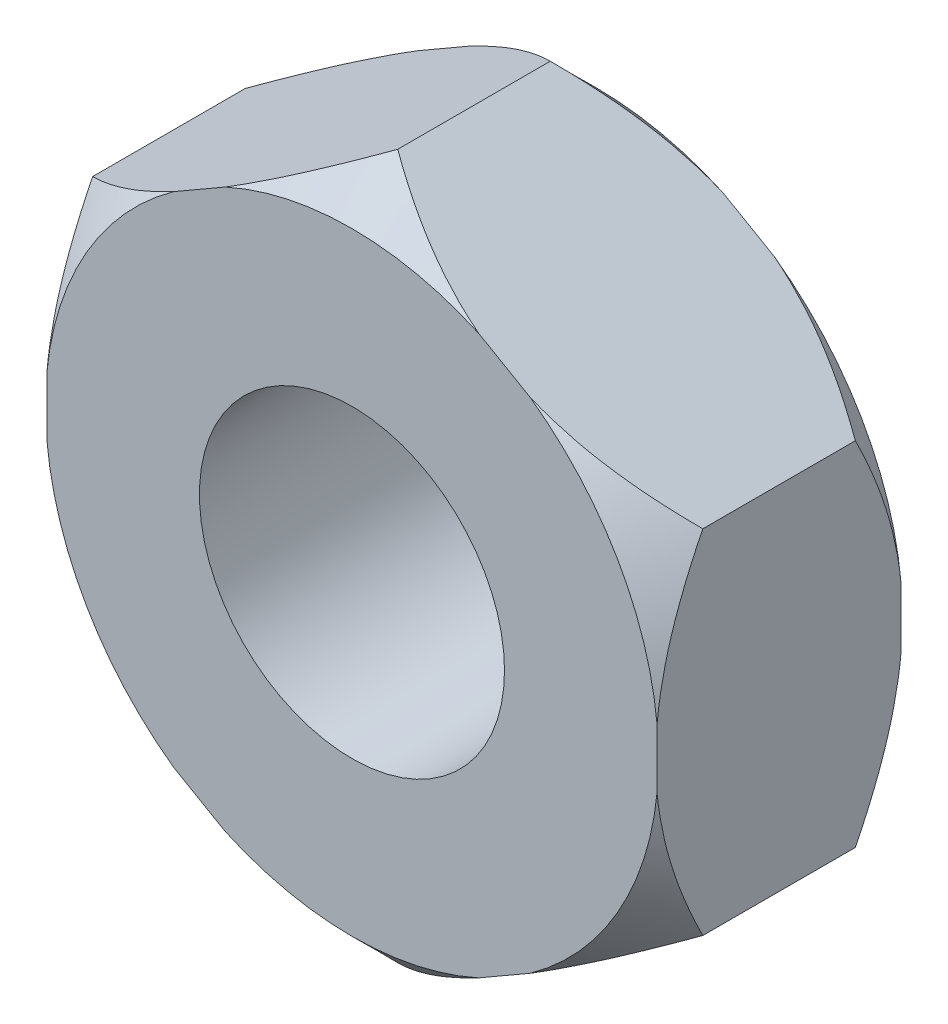
ISO-10303-21;
HEADER;
FILE_DESCRIPTION(('STEP AP214'),'2;1');
FILE_NAME('part.step','',(''),(''),'','','');
FILE_SCHEMA(('AUTOMOTIVE_DESIGN { 1 0 10303 214 1 1 1 1 }'));
ENDSEC;
DATA;
#1=APPLICATION_CONTEXT('core data for automotive mechanical design processes');
#2=APPLICATION_PROTOCOL_DEFINITION('international standard','automotive_design',2000,#1);
#3=PRODUCT_CONTEXT('',#1,'mechanical');
#4=PRODUCT('Part','Part','',(#3));
#5=PRODUCT_RELATED_PRODUCT_CATEGORY('part','',(#4));
#6=PRODUCT_DEFINITION_FORMATION('','',#4);
#7=PRODUCT_DEFINITION_CONTEXT('part definition',#1,'design');
#8=PRODUCT_DEFINITION('design','',#6,#7);
#9=PRODUCT_DEFINITION_SHAPE('','',#8);
#10=(LENGTH_UNIT() NAMED_UNIT(*) SI_UNIT(.MILLI.,.METRE.));
#11=(NAMED_UNIT(*) PLANE_ANGLE_UNIT() SI_UNIT($,.RADIAN.));
#12=(NAMED_UNIT(*) SI_UNIT($,.STERADIAN.) SOLID_ANGLE_UNIT());
#13=UNCERTAINTY_MEASURE_WITH_UNIT(LENGTH_MEASURE(1.E-05),#10,'distance_accuracy_value','');
#14=(GEOMETRIC_REPRESENTATION_CONTEXT(3) GLOBAL_UNCERTAINTY_ASSIGNED_CONTEXT((#13)) GLOBAL_UNIT_ASSIGNED_CONTEXT((#10,
#11,#12)) REPRESENTATION_CONTEXT('',''));
#15=CARTESIAN_POINT('',(0.,0.,0.));
#16=DIRECTION('',(0.,0.,1.));
#17=DIRECTION('',(1.,0.,0.));
#18=AXIS2_PLACEMENT_3D('',#15,#16,#17);
#19=CARTESIAN_POINT('',(2.,-1.15470053837925,1.6));
#20=DIRECTION('',(-1.,0.,0.));
#21=DIRECTION('',(0.,0.,1.));
#22=AXIS2_PLACEMENT_3D('',#19,#20,#21);
#23=PLANE('',#22);
#24=DIRECTION('',(0.,0.,-1.));
#25=VECTOR('',#24,1.);
#26=CARTESIAN_POINT('',(2.,1.15470053837925,1.6));
#27=LINE('',#26,#25);
#28=CARTESIAN_POINT('',(2.,1.15470053837925,1.3));
#29=VERTEX_POINT('',#28);
#30=CARTESIAN_POINT('',(2.,1.15470053837925,0.3));
#31=VERTEX_POINT('',#30);
#32=EDGE_CURVE('E194',#29,#31,#27,.T.);
#33=ORIENTED_EDGE('',*,*,#32,.F.);
#34=CARTESIAN_POINT('',(2.,1.15540053837925,1.29964992044597));
#35=CARTESIAN_POINT('',(2.,1.07598307970233,1.33933842871864));
#36=CARTESIAN_POINT('',(2.,0.995237332637928,1.37669722527411));
#37=CARTESIAN_POINT('',(2.,0.830585992046122,1.44510252811465));
#38=CARTESIAN_POINT('',(2.,0.74666471159049,1.47611093511361));
#39=CARTESIAN_POINT('',(2.,0.577441111036847,1.52923019261199));
#40=CARTESIAN_POINT('',(2.,0.492181962939463,1.55147466981095));
#41=CARTESIAN_POINT('',(2.,0.319785145341833,1.58574808429675));
#42=CARTESIAN_POINT('',(2.,0.232652754202702,1.59780263686519));
#43=CARTESIAN_POINT('',(2.,0.0825108919408736,1.6086780994365));
#44=CARTESIAN_POINT('',(2.,0.0196958053490039,1.61028949251019));
#45=CARTESIAN_POINT('',(2.,-0.105831974231886,1.60758533819763));
#46=CARTESIAN_POINT('',(2.,-0.16854462357856,1.60326771174166));
#47=CARTESIAN_POINT('',(2.,-0.293378079606286,1.58895120412576));
#48=CARTESIAN_POINT('',(2.,-0.355498143752271,1.5789459575977));
#49=CARTESIAN_POINT('',(2.,-0.47866417220405,1.553803483363));
#50=CARTESIAN_POINT('',(2.,-0.539710218381506,1.53866664863245));
#51=CARTESIAN_POINT('',(2.,-0.696176852271683,1.49369920691265));
#52=CARTESIAN_POINT('',(2.,-0.790624559128797,1.46046872044348));
#53=CARTESIAN_POINT('',(2.,-0.929498789020052,1.40436662645714));
#54=CARTESIAN_POINT('',(2.,-0.975263644766602,1.3846542331507));
#55=CARTESIAN_POINT('',(2.,-1.06594468936343,1.34343178020059));
#56=CARTESIAN_POINT('',(2.,-1.11086138103775,1.32192282944693));
#57=CARTESIAN_POINT('',(2.,-1.15540053837925,1.29964992044598));
#58=B_SPLINE_CURVE_WITH_KNOTS('',3,(#34,#35,#36,#37,#38,#39,#40,#41,#42,#43,#44,#45,#46,#47,#48,
#49,#50,#51,#52,#53,#54,#55,#56,#57),.UNSPECIFIED.,.F.,.F.,(4,2,2,2,2,2,2,2,2,2,2,4),(0.,
0.266531815535443,0.534618651038126,0.798443082516287,1.06160232698144,1.24984278596183,
1.43814927019127,1.62666691595567,1.81517012833258,2.11490891168658,2.26437241800826,
2.41374434313419),.UNSPECIFIED.);
#59=CARTESIAN_POINT('',(2.,0.194146046259595,1.6));
#60=VERTEX_POINT('',#59);
#61=EDGE_CURVE('E363',#29,#60,#58,.T.);
#62=ORIENTED_EDGE('',*,*,#61,.T.);
#63=DIRECTION('',(0.,1.,0.));
#64=VECTOR('',#63,1.);
#65=CARTESIAN_POINT('',(2.,-1.15470053837925,1.6));
#66=LINE('',#65,#64);
#67=CARTESIAN_POINT('',(2.,-0.194146046259594,1.6));
#68=VERTEX_POINT('',#67);
#69=EDGE_CURVE('E240',#68,#60,#66,.T.);
#70=ORIENTED_EDGE('',*,*,#69,.F.);
#71=CARTESIAN_POINT('',(2.,-1.15470053837925,1.3));
#72=VERTEX_POINT('',#71);
#73=EDGE_CURVE('E393',#68,#72,#58,.T.);
#74=ORIENTED_EDGE('',*,*,#73,.T.);
#75=DIRECTION('',(0.,0.,-1.));
#76=VECTOR('',#75,1.);
#77=CARTESIAN_POINT('',(2.,-1.15470053837925,1.6));
#78=LINE('',#77,#76);
#79=CARTESIAN_POINT('',(2.,-1.15470053837925,0.3));
#80=VERTEX_POINT('',#79);
#81=EDGE_CURVE('E245',#72,#80,#78,.T.);
#82=ORIENTED_EDGE('',*,*,#81,.T.);
#83=CARTESIAN_POINT('',(2.,1.15540053837925,0.300350079554025));
#84=CARTESIAN_POINT('',(2.,1.07598307970233,0.26066157128136));
#85=CARTESIAN_POINT('',(2.,0.995237332637928,0.223302774725892));
#86=CARTESIAN_POINT('',(2.,0.830585992046122,0.154897471885353));
#87=CARTESIAN_POINT('',(2.,0.74666471159049,0.123889064886386));
#88=CARTESIAN_POINT('',(2.,0.577441111036847,0.0707698073880139));
#89=CARTESIAN_POINT('',(2.,0.492181962939463,0.0485253301890504));
#90=CARTESIAN_POINT('',(2.,0.319785145341832,0.0142519157032477));
#91=CARTESIAN_POINT('',(2.,0.232652754202701,0.00219736313481565));
#92=CARTESIAN_POINT('',(2.,0.0825108919408722,-0.0086780994365017));
#93=CARTESIAN_POINT('',(2.,0.0196958053490022,-0.0102894925101871));
#94=CARTESIAN_POINT('',(2.,-0.105831974231888,-0.0075853381976253));
#95=CARTESIAN_POINT('',(2.,-0.168544623578563,-0.00326771174166417));
#96=CARTESIAN_POINT('',(2.,-0.293378079606289,0.0110487958742398));
#97=CARTESIAN_POINT('',(2.,-0.355498143752274,0.0210540424022981));
#98=CARTESIAN_POINT('',(2.,-0.478664172204053,0.0461965166370041));
#99=CARTESIAN_POINT('',(2.,-0.539710218381509,0.0613333513675514));
#100=CARTESIAN_POINT('',(2.,-0.696176852271686,0.106300793087349));
#101=CARTESIAN_POINT('',(2.,-0.790624559128799,0.13953127955652));
#102=CARTESIAN_POINT('',(2.,-0.929498789020054,0.195633373542859));
#103=CARTESIAN_POINT('',(2.,-0.975263644766603,0.215345766849299));
#104=CARTESIAN_POINT('',(2.,-1.06594468936343,0.25656821979941));
#105=CARTESIAN_POINT('',(2.,-1.11086138103775,0.278077170553066));
#106=CARTESIAN_POINT('',(2.,-1.15540053837925,0.300350079554025));
#107=B_SPLINE_CURVE_WITH_KNOTS('',3,(#83,#84,#85,#86,#87,#88,#89,#90,#91,#92,#93,#94,#95,#96,
#97,#98,#99,#100,#101,#102,#103,#104,#105,#106),.UNSPECIFIED.,.F.,.F.,(4,2,2,2,2,2,2,2,2,2,2,4),
(0.,0.266531815535442,0.534618651038126,0.798443082516287,1.06160232698145,1.24984278596183,
1.43814927019128,1.62666691595567,1.81517012833258,2.11490891168658,2.26437241800826,
2.41374434313419),.UNSPECIFIED.);
#108=CARTESIAN_POINT('',(2.,-0.194146046259585,0.));
#109=VERTEX_POINT('',#108);
#110=EDGE_CURVE('E230',#109,#80,#107,.T.);
#111=ORIENTED_EDGE('',*,*,#110,.F.);
#112=DIRECTION('',(0.,1.,0.));
#113=VECTOR('',#112,1.);
#114=CARTESIAN_POINT('',(2.,-1.15470053837925,0.));
#115=LINE('',#114,#113);
#116=CARTESIAN_POINT('',(2.,0.194146046259586,0.));
#117=VERTEX_POINT('',#116);
#118=EDGE_CURVE('E359',#109,#117,#115,.T.);
#119=ORIENTED_EDGE('',*,*,#118,.T.);
#120=EDGE_CURVE('E407',#31,#117,#107,.T.);
#121=ORIENTED_EDGE('',*,*,#120,.F.);
#122=EDGE_LOOP('',(#33,#62,#70,#74,#82,#111,#119,#121));
#123=FACE_BOUND('',#122,.T.);
#124=ADVANCED_FACE('F38',(#123),#23,.F.);
#125=CARTESIAN_POINT('',(2.,1.15470053837925,1.6));
#126=DIRECTION('',(-0.5,-0.866025403784438,0.));
#127=DIRECTION('',(0.866025403784439,-0.5,0.));
#128=AXIS2_PLACEMENT_3D('',#125,#126,#127);
#129=PLANE('',#128);
#130=DIRECTION('',(0.,0.,-1.));
#131=VECTOR('',#130,1.);
#132=CARTESIAN_POINT('',(0.,2.3094010767585,1.6));
#133=LINE('',#132,#131);
#134=CARTESIAN_POINT('',(0.,2.3094010767585,1.3));
#135=VERTEX_POINT('',#134);
#136=CARTESIAN_POINT('',(0.,2.3094010767585,0.3));
#137=VERTEX_POINT('',#136);
#138=EDGE_CURVE('E190',#135,#137,#133,.T.);
#139=ORIENTED_EDGE('',*,*,#138,.F.);
#140=CARTESIAN_POINT('',(-0.0007,2.30980522194694,1.29959574874202));
#141=CARTESIAN_POINT('',(0.068083196107106,2.27009322515878,1.33929028933997));
#142=CARTESIAN_POINT('',(0.138016875531649,2.22971699651759,1.37665501862968));
#143=CARTESIAN_POINT('',(0.280621300984799,2.14738429309459,1.4450716391226));
#144=CARTESIAN_POINT('',(0.353305638434037,2.1054199713024,1.47608541683105));
#145=CARTESIAN_POINT('',(0.499870494418703,2.02080071224591,1.52921412866013));
#146=CARTESIAN_POINT('',(0.573713608315188,1.97816737055998,1.5514627364308));
#147=CARTESIAN_POINT('',(0.723027103507985,1.89196118391677,1.58574275518007));
#148=CARTESIAN_POINT('',(0.798492911093949,1.8483909795924,1.59779979274057));
#149=CARTESIAN_POINT('',(0.928526877276862,1.7733158342129,1.60867731831624));
#150=CARTESIAN_POINT('',(0.982926610656792,1.74190813350216,1.6102893184227));
#151=CARTESIAN_POINT('',(1.09163745254847,1.67914389967217,1.60758630879543));
#152=CARTESIAN_POINT('',(1.14594852327715,1.64778738836699,1.60326921971537));
#153=CARTESIAN_POINT('',(1.25405816655225,1.58537025672011,1.588953683966));
#154=CARTESIAN_POINT('',(1.30785609587052,1.55431000774636,1.57894886973377));
#155=CARTESIAN_POINT('',(1.41452176923082,1.4927265525185,1.55380714596106));
#156=CARTESIAN_POINT('',(1.46738958415813,1.46220330533875,1.53867062931246));
#157=CARTESIAN_POINT('',(1.60291313285527,1.38395874801692,1.49369774160604));
#158=CARTESIAN_POINT('',(1.68472571145274,1.33672423374058,1.46045890953942));
#159=CARTESIAN_POINT('',(1.80502095591802,1.26727174196632,1.40434178449648));
#160=CARTESIAN_POINT('',(1.84466318671434,1.24438428934479,1.38462396295642));
#161=CARTESIAN_POINT('',(1.92321234774083,1.19903391008152,1.34339000488177));
#162=CARTESIAN_POINT('',(1.96211971404935,1.17657073166984,1.32187497874848));
#163=CARTESIAN_POINT('',(2.0007,1.15429639319082,1.29959574874202));
#164=B_SPLINE_CURVE_WITH_KNOTS('',3,(#140,#141,#142,#143,#144,#145,#146,#147,#148,#149,#150,
#151,#152,#153,#154,#155,#156,#157,#158,#159,#160,#161,#162,#163),.UNSPECIFIED.,.F.,.F.,(4,2,2,
2,2,2,2,2,2,2,2,4),(0.,0.266557499637864,0.534670596071515,0.798519927456668,1.06170382238087,
1.24994527236908,1.43825275596299,1.62677147123019,1.81527575644104,2.11508275465517,
2.26458038271749,2.41398631747759),.UNSPECIFIED.);
#165=CARTESIAN_POINT('',(0.831864591894883,1.82912383069867,1.6));
#166=VERTEX_POINT('',#165);
#167=EDGE_CURVE('E336',#135,#166,#164,.T.);
#168=ORIENTED_EDGE('',*,*,#167,.T.);
#169=DIRECTION('',(-0.866025403784439,0.5,0.));
#170=VECTOR('',#169,1.);
#171=CARTESIAN_POINT('',(2.,1.15470053837925,1.6));
#172=LINE('',#171,#170);
#173=CARTESIAN_POINT('',(1.16813540810512,1.63497778443908,1.6));
#174=VERTEX_POINT('',#173);
#175=EDGE_CURVE('E346',#174,#166,#172,.T.);
#176=ORIENTED_EDGE('',*,*,#175,.F.);
#177=EDGE_CURVE('E343',#174,#29,#164,.T.);
#178=ORIENTED_EDGE('',*,*,#177,.T.);
#179=ORIENTED_EDGE('',*,*,#32,.T.);
#180=CARTESIAN_POINT('',(-0.0007,2.30980522194694,0.30040425125798));
#181=CARTESIAN_POINT('',(0.0680831961071059,2.27009322515878,0.260709710660034));
#182=CARTESIAN_POINT('',(0.138016875531649,2.22971699651759,0.223344981370319));
#183=CARTESIAN_POINT('',(0.280621300984799,2.14738429309459,0.154928360877404));
#184=CARTESIAN_POINT('',(0.353305638434037,2.1054199713024,0.123914583168952));
#185=CARTESIAN_POINT('',(0.499870494418703,2.02080071224591,0.0707858713398733));
#186=CARTESIAN_POINT('',(0.573713608315188,1.97816737055998,0.0485372635691986));
#187=CARTESIAN_POINT('',(0.723027103507985,1.89196118391677,0.0142572448199338));
#188=CARTESIAN_POINT('',(0.798492911093949,1.8483909795924,0.00220020725943478));
#189=CARTESIAN_POINT('',(0.928526877276863,1.7733158342129,-0.00867731831624132));
#190=CARTESIAN_POINT('',(0.982926610656792,1.74190813350216,-0.0102893184226965));
#191=CARTESIAN_POINT('',(1.09163745254847,1.67914389967217,-0.00758630879543114));
#192=CARTESIAN_POINT('',(1.14594852327715,1.64778738836699,-0.00326921971536437));
#193=CARTESIAN_POINT('',(1.25405816655225,1.58537025672011,0.0110463160340035));
#194=CARTESIAN_POINT('',(1.30785609587052,1.55431000774636,0.0210511302662269));
#195=CARTESIAN_POINT('',(1.41452176923082,1.4927265525185,0.0461928540389417));
#196=CARTESIAN_POINT('',(1.46738958415814,1.46220330533875,0.0613293706875385));
#197=CARTESIAN_POINT('',(1.60291313285528,1.38395874801692,0.106302258393956));
#198=CARTESIAN_POINT('',(1.68472571145274,1.33672423374058,0.139541090460579));
#199=CARTESIAN_POINT('',(1.80502095591802,1.26727174196632,0.195658215503524));
#200=CARTESIAN_POINT('',(1.84466318671434,1.24438428934479,0.215376037043584));
#201=CARTESIAN_POINT('',(1.92321234774083,1.19903391008152,0.256609995118227));
#202=CARTESIAN_POINT('',(1.96211971404935,1.17657073166984,0.278125021251518));
#203=CARTESIAN_POINT('',(2.0007,1.15429639319082,0.30040425125798));
#204=B_SPLINE_CURVE_WITH_KNOTS('',3,(#180,#181,#182,#183,#184,#185,#186,#187,#188,#189,#190,
#191,#192,#193,#194,#195,#196,#197,#198,#199,#200,#201,#202,#203),.UNSPECIFIED.,.F.,.F.,(4,2,2,
2,2,2,2,2,2,2,2,4),(0.,0.266557499637864,0.534670596071515,0.798519927456668,1.06170382238087,
1.24994527236908,1.43825275596299,1.62677147123019,1.81527575644104,2.11508275465517,
2.26458038271749,2.41398631747759),.UNSPECIFIED.);
#205=CARTESIAN_POINT('',(1.16813540810511,1.63497778443909,0.));
#206=VERTEX_POINT('',#205);
#207=EDGE_CURVE('E369',#206,#31,#204,.T.);
#208=ORIENTED_EDGE('',*,*,#207,.F.);
#209=DIRECTION('',(-0.866025403784439,0.5,0.));
#210=VECTOR('',#209,1.);
#211=CARTESIAN_POINT('',(2.,1.15470053837925,0.));
#212=LINE('',#211,#210);
#213=CARTESIAN_POINT('',(0.831864591894891,1.82912383069867,0.));
#214=VERTEX_POINT('',#213);
#215=EDGE_CURVE('E362',#206,#214,#212,.T.);
#216=ORIENTED_EDGE('',*,*,#215,.T.);
#217=EDGE_CURVE('E309',#137,#214,#204,.T.);
#218=ORIENTED_EDGE('',*,*,#217,.F.);
#219=EDGE_LOOP('',(#139,#168,#176,#178,#179,#208,#216,#218));
#220=FACE_BOUND('',#219,.T.);
#221=ADVANCED_FACE('F317',(#220),#129,.F.);
#222=CARTESIAN_POINT('',(0.,2.3094010767585,1.6));
#223=DIRECTION('',(0.5,-0.866025403784438,0.));
#224=DIRECTION('',(0.866025403784439,0.5,0.));
#225=AXIS2_PLACEMENT_3D('',#222,#223,#224);
#226=PLANE('',#225);
#227=DIRECTION('',(0.,0.,-1.));
#228=VECTOR('',#227,1.);
#229=CARTESIAN_POINT('',(-2.,1.15470053837925,1.6));
#230=LINE('',#229,#228);
#231=CARTESIAN_POINT('',(-2.,1.15470053837925,1.3));
#232=VERTEX_POINT('',#231);
#233=CARTESIAN_POINT('',(-2.,1.15470053837925,0.3));
#234=VERTEX_POINT('',#233);
#235=EDGE_CURVE('E179',#232,#234,#230,.T.);
#236=ORIENTED_EDGE('',*,*,#235,.F.);
#237=CARTESIAN_POINT('',(-2.0007,1.15429639319082,1.29959574874202));
#238=CARTESIAN_POINT('',(-1.93191680389289,1.19400838997898,1.33929028933997));
#239=CARTESIAN_POINT('',(-1.86198312446835,1.23438461862016,1.37665501862968));
#240=CARTESIAN_POINT('',(-1.7193786990152,1.31671732204317,1.4450716391226));
#241=CARTESIAN_POINT('',(-1.64669436156596,1.35868164383535,1.47608541683105));
#242=CARTESIAN_POINT('',(-1.5001295055813,1.44330090289184,1.52921412866013));
#243=CARTESIAN_POINT('',(-1.42628639168481,1.48593424457778,1.5514627364308));
#244=CARTESIAN_POINT('',(-1.27697289649201,1.57214043122098,1.58574275518007));
#245=CARTESIAN_POINT('',(-1.20150708890605,1.61571063554535,1.59779979274057));
#246=CARTESIAN_POINT('',(-1.07147312272314,1.69078578092485,1.60867731831624));
#247=CARTESIAN_POINT('',(-1.01707338934321,1.7221934816356,1.6102893184227));
#248=CARTESIAN_POINT('',(-0.908362547451533,1.78495771546559,1.60758630879543));
#249=CARTESIAN_POINT('',(-0.85405147672285,1.81631422677077,1.60326921971537));
#250=CARTESIAN_POINT('',(-0.745941833447751,1.87873135841764,1.588953683966));
#251=CARTESIAN_POINT('',(-0.692143904129476,1.90979160739139,1.57894886973377));
#252=CARTESIAN_POINT('',(-0.585478230769179,1.97137506261925,1.55380714596106));
#253=CARTESIAN_POINT('',(-0.532610415841865,2.001898309799,1.53867062931246));
#254=CARTESIAN_POINT('',(-0.397086867144726,2.08014286712083,1.49369774160604));
#255=CARTESIAN_POINT('',(-0.315274288547261,2.12737738139717,1.46045890953942));
#256=CARTESIAN_POINT('',(-0.19497904408198,2.19682987317144,1.40434178449648));
#257=CARTESIAN_POINT('',(-0.155336813285661,2.21971732579297,1.38462396295642));
#258=CARTESIAN_POINT('',(-0.0767876522591739,2.26506770505623,1.34339000488177));
#259=CARTESIAN_POINT('',(-0.0378802859506454,2.28753088346792,1.32187497874848));
#260=CARTESIAN_POINT('',(0.000700000000000051,2.30980522194694,1.29959574874202));
#261=B_SPLINE_CURVE_WITH_KNOTS('',3,(#237,#238,#239,#240,#241,#242,#243,#244,#245,#246,#247,
#248,#249,#250,#251,#252,#253,#254,#255,#256,#257,#258,#259,#260),.UNSPECIFIED.,.F.,.F.,(4,2,2,
2,2,2,2,2,2,2,2,4),(0.,0.266557499637864,0.534670596071515,0.798519927456668,1.06170382238087,
1.24994527236908,1.43825275596299,1.62677147123019,1.81527575644104,2.11508275465517,
2.26458038271749,2.41398631747759),.UNSPECIFIED.);
#262=CARTESIAN_POINT('',(-1.16813540810512,1.63497778443907,1.6));
#263=VERTEX_POINT('',#262);
#264=EDGE_CURVE('E322',#232,#263,#261,.T.);
#265=ORIENTED_EDGE('',*,*,#264,.T.);
#266=DIRECTION('',(-0.866025403784438,-0.5,0.));
#267=VECTOR('',#266,1.);
#268=CARTESIAN_POINT('',(0.,2.3094010767585,1.6));
#269=LINE('',#268,#267);
#270=CARTESIAN_POINT('',(-0.831864591894875,1.82912383069868,1.6));
#271=VERTEX_POINT('',#270);
#272=EDGE_CURVE('E349',#271,#263,#269,.T.);
#273=ORIENTED_EDGE('',*,*,#272,.F.);
#274=EDGE_CURVE('E329',#271,#135,#261,.T.);
#275=ORIENTED_EDGE('',*,*,#274,.T.);
#276=ORIENTED_EDGE('',*,*,#138,.T.);
#277=CARTESIAN_POINT('',(-2.0007,1.15429639319082,0.30040425125798));
#278=CARTESIAN_POINT('',(-1.93191680389289,1.19400838997898,0.260709710660033));
#279=CARTESIAN_POINT('',(-1.86198312446835,1.23438461862016,0.223344981370318));
#280=CARTESIAN_POINT('',(-1.7193786990152,1.31671732204317,0.154928360877404));
#281=CARTESIAN_POINT('',(-1.64669436156596,1.35868164383535,0.123914583168951));
#282=CARTESIAN_POINT('',(-1.5001295055813,1.44330090289184,0.070785871339873));
#283=CARTESIAN_POINT('',(-1.42628639168481,1.48593424457778,0.048537263569198));
#284=CARTESIAN_POINT('',(-1.27697289649201,1.57214043122098,0.0142572448199332));
#285=CARTESIAN_POINT('',(-1.20150708890605,1.61571063554535,0.00220020725943434));
#286=CARTESIAN_POINT('',(-1.07147312272314,1.69078578092485,-0.00867731831624174));
#287=CARTESIAN_POINT('',(-1.01707338934321,1.7221934816356,-0.010289318422697));
#288=CARTESIAN_POINT('',(-0.908362547451531,1.78495771546559,-0.00758630879543133));
#289=CARTESIAN_POINT('',(-0.854051476722848,1.81631422677077,-0.00326921971536426));
#290=CARTESIAN_POINT('',(-0.745941833447749,1.87873135841764,0.0110463160340036));
#291=CARTESIAN_POINT('',(-0.692143904129474,1.90979160739139,0.0210511302662267));
#292=CARTESIAN_POINT('',(-0.585478230769176,1.97137506261925,0.0461928540389414));
#293=CARTESIAN_POINT('',(-0.532610415841862,2.00189830979901,0.0613293706875384));
#294=CARTESIAN_POINT('',(-0.397086867144724,2.08014286712083,0.106302258393956));
#295=CARTESIAN_POINT('',(-0.315274288547259,2.12737738139718,0.13954109046058));
#296=CARTESIAN_POINT('',(-0.194979044081979,2.19682987317144,0.195658215503524));
#297=CARTESIAN_POINT('',(-0.155336813285661,2.21971732579297,0.215376037043584));
#298=CARTESIAN_POINT('',(-0.0767876522591738,2.26506770505623,0.256609995118227));
#299=CARTESIAN_POINT('',(-0.0378802859506454,2.28753088346792,0.278125021251518));
#300=CARTESIAN_POINT('',(0.000699999999999816,2.30980522194694,0.30040425125798));
#301=B_SPLINE_CURVE_WITH_KNOTS('',3,(#277,#278,#279,#280,#281,#282,#283,#284,#285,#286,#287,
#288,#289,#290,#291,#292,#293,#294,#295,#296,#297,#298,#299,#300),.UNSPECIFIED.,.F.,.F.,(4,2,2,
2,2,2,2,2,2,2,2,4),(0.,0.266557499637864,0.534670596071515,0.798519927456668,1.06170382238087,
1.24994527236908,1.43825275596299,1.62677147123019,1.81527575644104,2.11508275465517,
2.26458038271749,2.41398631747759),.UNSPECIFIED.);
#302=CARTESIAN_POINT('',(-0.831864591894883,1.82912383069867,0.));
#303=VERTEX_POINT('',#302);
#304=EDGE_CURVE('E183',#303,#137,#301,.T.);
#305=ORIENTED_EDGE('',*,*,#304,.F.);
#306=DIRECTION('',(-0.866025403784438,-0.5,0.));
#307=VECTOR('',#306,1.);
#308=CARTESIAN_POINT('',(0.,2.3094010767585,0.));
#309=LINE('',#308,#307);
#310=CARTESIAN_POINT('',(-1.16813540810512,1.63497778443908,0.));
#311=VERTEX_POINT('',#310);
#312=EDGE_CURVE('E182',#303,#311,#309,.T.);
#313=ORIENTED_EDGE('',*,*,#312,.T.);
#314=EDGE_CURVE('E165',#234,#311,#301,.T.);
#315=ORIENTED_EDGE('',*,*,#314,.F.);
#316=EDGE_LOOP('',(#236,#265,#273,#275,#276,#305,#313,#315));
#317=FACE_BOUND('',#316,.T.);
#318=ADVANCED_FACE('F177',(#317),#226,.F.);
#319=CARTESIAN_POINT('',(-2.,1.15470053837925,1.6));
#320=DIRECTION('',(1.,0.,0.));
#321=DIRECTION('',(0.,0.,-1.));
#322=AXIS2_PLACEMENT_3D('',#319,#320,#321);
#323=PLANE('',#322);
#324=DIRECTION('',(0.,0.,-1.));
#325=VECTOR('',#324,1.);
#326=CARTESIAN_POINT('',(-2.,-1.15470053837925,1.6));
#327=LINE('',#326,#325);
#328=CARTESIAN_POINT('',(-2.,-1.15470053837925,1.3));
#329=VERTEX_POINT('',#328);
#330=CARTESIAN_POINT('',(-2.,-1.15470053837925,0.3));
#331=VERTEX_POINT('',#330);
#332=EDGE_CURVE('E191',#329,#331,#327,.T.);
#333=ORIENTED_EDGE('',*,*,#332,.F.);
#334=CARTESIAN_POINT('',(-2.,-1.15540053837925,1.29964992044597));
#335=CARTESIAN_POINT('',(-2.,-1.07598307970233,1.33933842871864));
#336=CARTESIAN_POINT('',(-2.,-0.995237332637929,1.37669722527411));
#337=CARTESIAN_POINT('',(-2.,-0.830585992046123,1.44510252811465));
#338=CARTESIAN_POINT('',(-2.,-0.746664711590491,1.47611093511361));
#339=CARTESIAN_POINT('',(-2.,-0.577441111036848,1.52923019261199));
#340=CARTESIAN_POINT('',(-2.,-0.492181962939464,1.55147466981095));
#341=CARTESIAN_POINT('',(-2.,-0.319785145341833,1.58574808429675));
#342=CARTESIAN_POINT('',(-2.,-0.232652754202703,1.59780263686519));
#343=CARTESIAN_POINT('',(-2.,-0.0825108919408738,1.6086780994365));
#344=CARTESIAN_POINT('',(-2.,-0.019695805349004,1.61028949251019));
#345=CARTESIAN_POINT('',(-2.,0.105831974231886,1.60758533819763));
#346=CARTESIAN_POINT('',(-2.,0.16854462357856,1.60326771174167));
#347=CARTESIAN_POINT('',(-2.,0.293378079606286,1.58895120412576));
#348=CARTESIAN_POINT('',(-2.,0.355498143752271,1.5789459575977));
#349=CARTESIAN_POINT('',(-2.,0.47866417220405,1.553803483363));
#350=CARTESIAN_POINT('',(-2.,0.539710218381506,1.53866664863245));
#351=CARTESIAN_POINT('',(-2.,0.696176852271682,1.49369920691265));
#352=CARTESIAN_POINT('',(-2.,0.790624559128796,1.46046872044348));
#353=CARTESIAN_POINT('',(-2.,0.929498789020053,1.40436662645714));
#354=CARTESIAN_POINT('',(-2.,0.975263644766603,1.3846542331507));
#355=CARTESIAN_POINT('',(-2.,1.06594468936343,1.34343178020059));
#356=CARTESIAN_POINT('',(-2.,1.11086138103775,1.32192282944694));
#357=CARTESIAN_POINT('',(-2.,1.15540053837925,1.29964992044598));
#358=B_SPLINE_CURVE_WITH_KNOTS('',3,(#334,#335,#336,#337,#338,#339,#340,#341,#342,#343,#344,
#345,#346,#347,#348,#349,#350,#351,#352,#353,#354,#355,#356,#357),.UNSPECIFIED.,.F.,.F.,(4,2,2,
2,2,2,2,2,2,2,2,4),(0.,0.266531815535442,0.534618651038125,0.798443082516287,1.06160232698145,
1.24984278596183,1.43814927019127,1.62666691595567,1.81517012833258,2.11490891168658,
2.26437241800826,2.41374434313419),.UNSPECIFIED.);
#359=CARTESIAN_POINT('',(-2.,-0.194146046259598,1.6));
#360=VERTEX_POINT('',#359);
#361=EDGE_CURVE('E330',#329,#360,#358,.T.);
#362=ORIENTED_EDGE('',*,*,#361,.T.);
#363=DIRECTION('',(0.,-1.,0.));
#364=VECTOR('',#363,1.);
#365=CARTESIAN_POINT('',(-2.,1.15470053837925,1.6));
#366=LINE('',#365,#364);
#367=CARTESIAN_POINT('',(-2.,0.194146046259599,1.6));
#368=VERTEX_POINT('',#367);
#369=EDGE_CURVE('E352',#368,#360,#366,.T.);
#370=ORIENTED_EDGE('',*,*,#369,.F.);
#371=EDGE_CURVE('E189',#368,#232,#358,.T.);
#372=ORIENTED_EDGE('',*,*,#371,.T.);
#373=ORIENTED_EDGE('',*,*,#235,.T.);
#374=CARTESIAN_POINT('',(-2.,-1.15540053837925,0.300350079554026));
#375=CARTESIAN_POINT('',(-2.,-1.07598307970233,0.26066157128136));
#376=CARTESIAN_POINT('',(-2.,-0.995237332637928,0.223302774725892));
#377=CARTESIAN_POINT('',(-2.,-0.830585992046122,0.154897471885353));
#378=CARTESIAN_POINT('',(-2.,-0.74666471159049,0.123889064886386));
#379=CARTESIAN_POINT('',(-2.,-0.577441111036847,0.0707698073880138));
#380=CARTESIAN_POINT('',(-2.,-0.492181962939463,0.04852533018905));
#381=CARTESIAN_POINT('',(-2.,-0.319785145341832,0.0142519157032472));
#382=CARTESIAN_POINT('',(-2.,-0.232652754202701,0.00219736313481522));
#383=CARTESIAN_POINT('',(-2.,-0.0825108919408723,-0.00867809943650212));
#384=CARTESIAN_POINT('',(-2.,-0.0196958053490024,-0.0102894925101876));
#385=CARTESIAN_POINT('',(-2.,0.105831974231888,-0.00758533819762571));
#386=CARTESIAN_POINT('',(-2.,0.168544623578562,-0.00326771174166449));
#387=CARTESIAN_POINT('',(-2.,0.293378079606288,0.0110487958742392));
#388=CARTESIAN_POINT('',(-2.,0.355498143752273,0.0210540424022972));
#389=CARTESIAN_POINT('',(-2.,0.478664172204053,0.0461965166370033));
#390=CARTESIAN_POINT('',(-2.,0.539710218381509,0.0613333513675508));
#391=CARTESIAN_POINT('',(-2.,0.696176852271685,0.106300793087349));
#392=CARTESIAN_POINT('',(-2.,0.790624559128799,0.139531279556519));
#393=CARTESIAN_POINT('',(-2.,0.929498789020054,0.195633373542859));
#394=CARTESIAN_POINT('',(-2.,0.975263644766603,0.215345766849298));
#395=CARTESIAN_POINT('',(-2.,1.06594468936343,0.256568219799409));
#396=CARTESIAN_POINT('',(-2.,1.11086138103775,0.278077170553066));
#397=CARTESIAN_POINT('',(-2.,1.15540053837925,0.300350079554025));
#398=B_SPLINE_CURVE_WITH_KNOTS('',3,(#374,#375,#376,#377,#378,#379,#380,#381,#382,#383,#384,
#385,#386,#387,#388,#389,#390,#391,#392,#393,#394,#395,#396,#397),.UNSPECIFIED.,.F.,.F.,(4,2,2,
2,2,2,2,2,2,2,2,4),(0.,0.266531815535443,0.534618651038127,0.798443082516288,1.06160232698145,
1.24984278596183,1.43814927019128,1.62666691595567,1.81517012833258,2.11490891168658,
2.26437241800826,2.41374434313419),.UNSPECIFIED.);
#399=CARTESIAN_POINT('',(-2.,0.19414604625959,0.));
#400=VERTEX_POINT('',#399);
#401=EDGE_CURVE('E162',#400,#234,#398,.T.);
#402=ORIENTED_EDGE('',*,*,#401,.F.);
#403=DIRECTION('',(0.,-1.,0.));
#404=VECTOR('',#403,1.);
#405=CARTESIAN_POINT('',(-2.,1.15470053837925,0.));
#406=LINE('',#405,#404);
#407=CARTESIAN_POINT('',(-2.,-0.194146046259589,0.));
#408=VERTEX_POINT('',#407);
#409=EDGE_CURVE('E237',#400,#408,#406,.T.);
#410=ORIENTED_EDGE('',*,*,#409,.T.);
#411=EDGE_CURVE('E172',#331,#408,#398,.T.);
#412=ORIENTED_EDGE('',*,*,#411,.F.);
#413=EDGE_LOOP('',(#333,#362,#370,#372,#373,#402,#410,#412));
#414=FACE_BOUND('',#413,.T.);
#415=ADVANCED_FACE('F187',(#414),#323,.F.);
#416=CARTESIAN_POINT('',(-2.,-1.15470053837925,1.6));
#417=DIRECTION('',(0.5,0.866025403784439,0.));
#418=DIRECTION('',(-0.866025403784439,0.5,0.));
#419=AXIS2_PLACEMENT_3D('',#416,#417,#418);
#420=PLANE('',#419);
#421=DIRECTION('',(0.,0.,-1.));
#422=VECTOR('',#421,1.);
#423=CARTESIAN_POINT('',(0.,-2.3094010767585,1.6));
#424=LINE('',#423,#422);
#425=CARTESIAN_POINT('',(0.,-2.3094010767585,1.3));
#426=VERTEX_POINT('',#425);
#427=CARTESIAN_POINT('',(0.,-2.3094010767585,0.3));
#428=VERTEX_POINT('',#427);
#429=EDGE_CURVE('E197',#426,#428,#424,.T.);
#430=ORIENTED_EDGE('',*,*,#429,.F.);
#431=CARTESIAN_POINT('',(0.000699999999999566,-2.30980522194694,1.29959574874202));
#432=CARTESIAN_POINT('',(-0.0680831961071066,-2.27009322515878,1.33929028933997));
#433=CARTESIAN_POINT('',(-0.13801687553165,-2.22971699651759,1.37665501862968));
#434=CARTESIAN_POINT('',(-0.280621300984799,-2.14738429309459,1.4450716391226));
#435=CARTESIAN_POINT('',(-0.353305638434038,-2.1054199713024,1.47608541683105));
#436=CARTESIAN_POINT('',(-0.499870494418704,-2.02080071224591,1.52921412866013));
#437=CARTESIAN_POINT('',(-0.573713608315189,-1.97816737055998,1.5514627364308));
#438=CARTESIAN_POINT('',(-0.723027103507986,-1.89196118391677,1.58574275518007));
#439=CARTESIAN_POINT('',(-0.79849291109395,-1.8483909795924,1.59779979274056));
#440=CARTESIAN_POINT('',(-0.928526877276863,-1.7733158342129,1.60867731831624));
#441=CARTESIAN_POINT('',(-0.982926610656793,-1.74190813350216,1.6102893184227));
#442=CARTESIAN_POINT('',(-1.09163745254847,-1.67914389967217,1.60758630879543));
#443=CARTESIAN_POINT('',(-1.14594852327715,-1.64778738836699,1.60326921971536));
#444=CARTESIAN_POINT('',(-1.25405816655225,-1.58537025672011,1.588953683966));
#445=CARTESIAN_POINT('',(-1.30785609587052,-1.55431000774636,1.57894886973377));
#446=CARTESIAN_POINT('',(-1.41452176923082,-1.4927265525185,1.55380714596106));
#447=CARTESIAN_POINT('',(-1.46738958415814,-1.46220330533875,1.53867062931246));
#448=CARTESIAN_POINT('',(-1.60291313285527,-1.38395874801692,1.49369774160604));
#449=CARTESIAN_POINT('',(-1.68472571145274,-1.33672423374058,1.46045890953942));
#450=CARTESIAN_POINT('',(-1.80502095591802,-1.26727174196632,1.40434178449648));
#451=CARTESIAN_POINT('',(-1.84466318671434,-1.24438428934479,1.38462396295642));
#452=CARTESIAN_POINT('',(-1.92321234774083,-1.19903391008152,1.34339000488177));
#453=CARTESIAN_POINT('',(-1.96211971404935,-1.17657073166984,1.32187497874848));
#454=CARTESIAN_POINT('',(-2.0007,-1.15429639319082,1.29959574874202));
#455=B_SPLINE_CURVE_WITH_KNOTS('',3,(#431,#432,#433,#434,#435,#436,#437,#438,#439,#440,#441,
#442,#443,#444,#445,#446,#447,#448,#449,#450,#451,#452,#453,#454),.UNSPECIFIED.,.F.,.F.,(4,2,2,
2,2,2,2,2,2,2,2,4),(0.,0.266557499637865,0.534670596071516,0.798519927456669,1.06170382238087,
1.24994527236908,1.43825275596299,1.62677147123019,1.81527575644104,2.11508275465517,
2.26458038271749,2.41398631747759),.UNSPECIFIED.);
#456=CARTESIAN_POINT('',(-0.831864591894893,-1.82912383069867,1.6));
#457=VERTEX_POINT('',#456);
#458=EDGE_CURVE('E257',#426,#457,#455,.T.);
#459=ORIENTED_EDGE('',*,*,#458,.T.);
#460=DIRECTION('',(0.866025403784439,-0.5,0.));
#461=VECTOR('',#460,1.);
#462=CARTESIAN_POINT('',(-2.,-1.15470053837925,1.6));
#463=LINE('',#462,#461);
#464=CARTESIAN_POINT('',(-1.16813540810511,-1.63497778443909,1.6));
#465=VERTEX_POINT('',#464);
#466=EDGE_CURVE('E355',#465,#457,#463,.T.);
#467=ORIENTED_EDGE('',*,*,#466,.F.);
#468=EDGE_CURVE('E62',#465,#329,#455,.T.);
#469=ORIENTED_EDGE('',*,*,#468,.T.);
#470=ORIENTED_EDGE('',*,*,#332,.T.);
#471=CARTESIAN_POINT('',(0.000699999999999566,-2.30980522194694,0.300404251257981));
#472=CARTESIAN_POINT('',(-0.0680831961071065,-2.27009322515878,0.260709710660035));
#473=CARTESIAN_POINT('',(-0.13801687553165,-2.22971699651759,0.22334498137032));
#474=CARTESIAN_POINT('',(-0.2806213009848,-2.14738429309459,0.154928360877405));
#475=CARTESIAN_POINT('',(-0.353305638434038,-2.1054199713024,0.123914583168952));
#476=CARTESIAN_POINT('',(-0.499870494418704,-2.02080071224591,0.0707858713398739));
#477=CARTESIAN_POINT('',(-0.57371360831519,-1.97816737055998,0.0485372635691992));
#478=CARTESIAN_POINT('',(-0.723027103507987,-1.89196118391677,0.0142572448199346));
#479=CARTESIAN_POINT('',(-0.798492911093951,-1.8483909795924,0.00220020725943572));
#480=CARTESIAN_POINT('',(-0.928526877276864,-1.7733158342129,-0.00867731831624051));
#481=CARTESIAN_POINT('',(-0.982926610656794,-1.74190813350216,-0.0102893184226959));
#482=CARTESIAN_POINT('',(-1.09163745254847,-1.67914389967217,-0.0075863087954302));
#483=CARTESIAN_POINT('',(-1.14594852327715,-1.64778738836698,-0.00326921971536305));
#484=CARTESIAN_POINT('',(-1.25405816655225,-1.58537025672011,0.011046316034005));
#485=CARTESIAN_POINT('',(-1.30785609587053,-1.55431000774636,0.0210511302662282));
#486=CARTESIAN_POINT('',(-1.41452176923082,-1.4927265525185,0.0461928540389429));
#487=CARTESIAN_POINT('',(-1.46738958415814,-1.46220330533875,0.0613293706875397));
#488=CARTESIAN_POINT('',(-1.60291313285528,-1.38395874801692,0.106302258393957));
#489=CARTESIAN_POINT('',(-1.68472571145274,-1.33672423374058,0.139541090460581));
#490=CARTESIAN_POINT('',(-1.80502095591802,-1.26727174196632,0.195658215503525));
#491=CARTESIAN_POINT('',(-1.84466318671434,-1.24438428934479,0.215376037043585));
#492=CARTESIAN_POINT('',(-1.92321234774083,-1.19903391008152,0.256609995118228));
#493=CARTESIAN_POINT('',(-1.96211971404935,-1.17657073166984,0.278125021251518));
#494=CARTESIAN_POINT('',(-2.0007,-1.15429639319082,0.30040425125798));
#495=B_SPLINE_CURVE_WITH_KNOTS('',3,(#471,#472,#473,#474,#475,#476,#477,#478,#479,#480,#481,
#482,#483,#484,#485,#486,#487,#488,#489,#490,#491,#492,#493,#494),.UNSPECIFIED.,.F.,.F.,(4,2,2,
2,2,2,2,2,2,2,2,4),(0.,0.266557499637864,0.534670596071516,0.79851992745667,1.06170382238087,
1.24994527236908,1.43825275596299,1.62677147123019,1.81527575644104,2.11508275465517,
2.26458038271749,2.41398631747759),.UNSPECIFIED.);
#496=CARTESIAN_POINT('',(-1.1681354081051,-1.63497778443909,0.));
#497=VERTEX_POINT('',#496);
#498=EDGE_CURVE('E220',#497,#331,#495,.T.);
#499=ORIENTED_EDGE('',*,*,#498,.F.);
#500=DIRECTION('',(0.866025403784439,-0.5,0.));
#501=VECTOR('',#500,1.);
#502=CARTESIAN_POINT('',(-2.,-1.15470053837925,0.));
#503=LINE('',#502,#501);
#504=CARTESIAN_POINT('',(-0.831864591894901,-1.82912383069866,0.));
#505=VERTEX_POINT('',#504);
#506=EDGE_CURVE('E229',#497,#505,#503,.T.);
#507=ORIENTED_EDGE('',*,*,#506,.T.);
#508=EDGE_CURVE('E232',#428,#505,#495,.T.);
#509=ORIENTED_EDGE('',*,*,#508,.F.);
#510=EDGE_LOOP('',(#430,#459,#467,#469,#470,#499,#507,#509));
#511=FACE_BOUND('',#510,.T.);
#512=ADVANCED_FACE('F227',(#511),#420,.F.);
#513=CARTESIAN_POINT('',(0.,-2.3094010767585,1.6));
#514=DIRECTION('',(-0.5,0.866025403784438,0.));
#515=DIRECTION('',(-0.866025403784438,-0.5,0.));
#516=AXIS2_PLACEMENT_3D('',#513,#514,#515);
#517=PLANE('',#516);
#518=ORIENTED_EDGE('',*,*,#81,.F.);
#519=CARTESIAN_POINT('',(2.0007,-1.15429639319082,1.29959574874202));
#520=CARTESIAN_POINT('',(1.93191680389289,-1.19400838997898,1.33929028933997));
#521=CARTESIAN_POINT('',(1.86198312446835,-1.23438461862016,1.37665501862968));
#522=CARTESIAN_POINT('',(1.7193786990152,-1.31671732204317,1.4450716391226));
#523=CARTESIAN_POINT('',(1.64669436156596,-1.35868164383535,1.47608541683105));
#524=CARTESIAN_POINT('',(1.5001295055813,-1.44330090289184,1.52921412866013));
#525=CARTESIAN_POINT('',(1.42628639168481,-1.48593424457778,1.5514627364308));
#526=CARTESIAN_POINT('',(1.27697289649202,-1.57214043122098,1.58574275518007));
#527=CARTESIAN_POINT('',(1.20150708890605,-1.61571063554535,1.59779979274057));
#528=CARTESIAN_POINT('',(1.07147312272314,-1.69078578092485,1.60867731831624));
#529=CARTESIAN_POINT('',(1.01707338934321,-1.7221934816356,1.6102893184227));
#530=CARTESIAN_POINT('',(0.908362547451533,-1.78495771546559,1.60758630879543));
#531=CARTESIAN_POINT('',(0.85405147672285,-1.81631422677077,1.60326921971536));
#532=CARTESIAN_POINT('',(0.745941833447752,-1.87873135841764,1.588953683966));
#533=CARTESIAN_POINT('',(0.692143904129477,-1.90979160739139,1.57894886973377));
#534=CARTESIAN_POINT('',(0.58547823076918,-1.97137506261925,1.55380714596106));
#535=CARTESIAN_POINT('',(0.532610415841866,-2.001898309799,1.53867062931246));
#536=CARTESIAN_POINT('',(0.397086867144727,-2.08014286712083,1.49369774160604));
#537=CARTESIAN_POINT('',(0.315274288547261,-2.12737738139717,1.46045890953942));
#538=CARTESIAN_POINT('',(0.19497904408198,-2.19682987317144,1.40434178449648));
#539=CARTESIAN_POINT('',(0.155336813285661,-2.21971732579297,1.38462396295642));
#540=CARTESIAN_POINT('',(0.0767876522591735,-2.26506770505623,1.34339000488177));
#541=CARTESIAN_POINT('',(0.037880285950645,-2.28753088346792,1.32187497874848));
#542=CARTESIAN_POINT('',(-0.000700000000000263,-2.30980522194694,1.29959574874202));
#543=B_SPLINE_CURVE_WITH_KNOTS('',3,(#519,#520,#521,#522,#523,#524,#525,#526,#527,#528,#529,
#530,#531,#532,#533,#534,#535,#536,#537,#538,#539,#540,#541,#542),.UNSPECIFIED.,.F.,.F.,(4,2,2,
2,2,2,2,2,2,2,2,4),(0.,0.266557499637864,0.534670596071515,0.798519927456668,1.06170382238087,
1.24994527236908,1.43825275596299,1.62677147123019,1.81527575644104,2.11508275465517,
2.26458038271749,2.41398631747759),.UNSPECIFIED.);
#544=CARTESIAN_POINT('',(1.16813540810512,-1.63497778443908,1.6));
#545=VERTEX_POINT('',#544);
#546=EDGE_CURVE('E402',#72,#545,#543,.T.);
#547=ORIENTED_EDGE('',*,*,#546,.T.);
#548=DIRECTION('',(0.866025403784438,0.500000000000001,0.));
#549=VECTOR('',#548,1.);
#550=CARTESIAN_POINT('',(0.,-2.3094010767585,1.6));
#551=LINE('',#550,#549);
#552=CARTESIAN_POINT('',(0.83186459189488,-1.82912383069868,1.6));
#553=VERTEX_POINT('',#552);
#554=EDGE_CURVE('E247',#553,#545,#551,.T.);
#555=ORIENTED_EDGE('',*,*,#554,.F.);
#556=EDGE_CURVE('E54',#553,#426,#543,.T.);
#557=ORIENTED_EDGE('',*,*,#556,.T.);
#558=ORIENTED_EDGE('',*,*,#429,.T.);
#559=CARTESIAN_POINT('',(2.0007,-1.15429639319082,0.30040425125798));
#560=CARTESIAN_POINT('',(1.93191680389289,-1.19400838997898,0.260709710660034));
#561=CARTESIAN_POINT('',(1.86198312446835,-1.23438461862016,0.223344981370319));
#562=CARTESIAN_POINT('',(1.7193786990152,-1.31671732204317,0.154928360877404));
#563=CARTESIAN_POINT('',(1.64669436156596,-1.35868164383535,0.123914583168952));
#564=CARTESIAN_POINT('',(1.5001295055813,-1.44330090289184,0.0707858713398735));
#565=CARTESIAN_POINT('',(1.42628639168481,-1.48593424457778,0.0485372635691987));
#566=CARTESIAN_POINT('',(1.27697289649201,-1.57214043122098,0.0142572448199338));
#567=CARTESIAN_POINT('',(1.20150708890605,-1.61571063554535,0.00220020725943471));
#568=CARTESIAN_POINT('',(1.07147312272314,-1.69078578092485,-0.00867731831624145));
#569=CARTESIAN_POINT('',(1.01707338934321,-1.7221934816356,-0.0102893184226966));
#570=CARTESIAN_POINT('',(0.908362547451531,-1.78495771546559,-0.00758630879543095));
#571=CARTESIAN_POINT('',(0.854051476722848,-1.81631422677077,-0.00326921971536393));
#572=CARTESIAN_POINT('',(0.745941833447749,-1.87873135841764,0.011046316034004));
#573=CARTESIAN_POINT('',(0.692143904129474,-1.90979160739139,0.0210511302662273));
#574=CARTESIAN_POINT('',(0.585478230769176,-1.97137506261925,0.0461928540389423));
#575=CARTESIAN_POINT('',(0.532610415841862,-2.001898309799,0.0613293706875395));
#576=CARTESIAN_POINT('',(0.397086867144724,-2.08014286712083,0.106302258393958));
#577=CARTESIAN_POINT('',(0.315274288547258,-2.12737738139718,0.139541090460581));
#578=CARTESIAN_POINT('',(0.194979044081979,-2.19682987317144,0.195658215503525));
#579=CARTESIAN_POINT('',(0.15533681328566,-2.21971732579297,0.215376037043585));
#580=CARTESIAN_POINT('',(0.076787652259173,-2.26506770505623,0.256609995118228));
#581=CARTESIAN_POINT('',(0.0378802859506447,-2.28753088346792,0.278125021251519));
#582=CARTESIAN_POINT('',(-0.000700000000000439,-2.30980522194694,0.300404251257981));
#583=B_SPLINE_CURVE_WITH_KNOTS('',3,(#559,#560,#561,#562,#563,#564,#565,#566,#567,#568,#569,
#570,#571,#572,#573,#574,#575,#576,#577,#578,#579,#580,#581,#582),.UNSPECIFIED.,.F.,.F.,(4,2,2,
2,2,2,2,2,2,2,2,4),(0.,0.266557499637864,0.534670596071516,0.798519927456669,1.06170382238087,
1.24994527236908,1.43825275596299,1.62677147123019,1.81527575644104,2.11508275465518,
2.26458038271749,2.41398631747759),.UNSPECIFIED.);
#584=CARTESIAN_POINT('',(0.831864591894887,-1.82912383069867,0.));
#585=VERTEX_POINT('',#584);
#586=EDGE_CURVE('E253',#585,#428,#583,.T.);
#587=ORIENTED_EDGE('',*,*,#586,.F.);
#588=DIRECTION('',(0.866025403784438,0.500000000000001,0.));
#589=VECTOR('',#588,1.);
#590=CARTESIAN_POINT('',(0.,-2.3094010767585,0.));
#591=LINE('',#590,#589);
#592=CARTESIAN_POINT('',(1.16813540810511,-1.63497778443908,0.));
#593=VERTEX_POINT('',#592);
#594=EDGE_CURVE('E236',#585,#593,#591,.T.);
#595=ORIENTED_EDGE('',*,*,#594,.T.);
#596=EDGE_CURVE('E260',#80,#593,#583,.T.);
#597=ORIENTED_EDGE('',*,*,#596,.F.);
#598=EDGE_LOOP('',(#518,#547,#555,#557,#558,#587,#595,#597));
#599=FACE_BOUND('',#598,.T.);
#600=ADVANCED_FACE('F252',(#599),#517,.F.);
#601=CARTESIAN_POINT('',(0.,0.,1.6));
#602=DIRECTION('',(0.,0.,1.));
#603=DIRECTION('',(1.,0.,0.));
#604=AXIS2_PLACEMENT_3D('',#601,#602,#603);
#605=PLANE('',#604);
#606=CARTESIAN_POINT('',(0.,0.,1.6));
#607=DIRECTION('',(0.,0.,1.));
#608=DIRECTION('',(1.,0.,0.));
#609=AXIS2_PLACEMENT_3D('',#606,#607,#608);
#610=CIRCLE('',#609,1.);
#611=CARTESIAN_POINT('',(1.,0.,1.6));
#612=VERTEX_POINT('',#611);
#613=EDGE_CURVE('E374',#612,#612,#610,.T.);
#614=ORIENTED_EDGE('',*,*,#613,.F.);
#615=EDGE_LOOP('',(#614));
#616=FACE_BOUND('',#615,.T.);
#617=CARTESIAN_POINT('',(0.,0.,1.6));
#618=DIRECTION('',(0.,0.,1.));
#619=DIRECTION('',(1.,0.,0.));
#620=AXIS2_PLACEMENT_3D('',#617,#618,#619);
#621=CIRCLE('',#620,2.0094010767585);
#622=EDGE_CURVE('E11',#68,#545,#621,.F.);
#623=ORIENTED_EDGE('',*,*,#622,.F.);
#624=ORIENTED_EDGE('',*,*,#69,.T.);
#625=EDGE_CURVE('E42',#174,#60,#621,.F.);
#626=ORIENTED_EDGE('',*,*,#625,.F.);
#627=ORIENTED_EDGE('',*,*,#175,.T.);
#628=EDGE_CURVE('E213',#271,#166,#621,.F.);
#629=ORIENTED_EDGE('',*,*,#628,.F.);
#630=ORIENTED_EDGE('',*,*,#272,.T.);
#631=CARTESIAN_POINT('',(0.,0.,1.6));
#632=DIRECTION('',(0.,0.,-1.));
#633=DIRECTION('',(-1.,0.,0.));
#634=AXIS2_PLACEMENT_3D('',#631,#632,#633);
#635=CIRCLE('',#634,2.0094010767585);
#636=EDGE_CURVE('E262',#368,#263,#635,.T.);
#637=ORIENTED_EDGE('',*,*,#636,.F.);
#638=ORIENTED_EDGE('',*,*,#369,.T.);
#639=EDGE_CURVE('E415',#465,#360,#621,.F.);
#640=ORIENTED_EDGE('',*,*,#639,.F.);
#641=ORIENTED_EDGE('',*,*,#466,.T.);
#642=EDGE_CURVE('E47',#553,#457,#621,.F.);
#643=ORIENTED_EDGE('',*,*,#642,.F.);
#644=ORIENTED_EDGE('',*,*,#554,.T.);
#645=EDGE_LOOP('',(#623,#624,#626,#627,#629,#630,#637,#638,#640,#641,#643,#644));
#646=FACE_BOUND('',#645,.T.);
#647=ADVANCED_FACE('F292',(#616,#646),#605,.T.);
#648=CARTESIAN_POINT('',(0.,0.,0.));
#649=DIRECTION('',(0.,0.,1.));
#650=DIRECTION('',(1.,0.,0.));
#651=AXIS2_PLACEMENT_3D('',#648,#649,#650);
#652=PLANE('',#651);
#653=CARTESIAN_POINT('',(0.,0.,0.));
#654=DIRECTION('',(0.,0.,1.));
#655=DIRECTION('',(1.,0.,0.));
#656=AXIS2_PLACEMENT_3D('',#653,#654,#655);
#657=CIRCLE('',#656,1.);
#658=CARTESIAN_POINT('',(1.,0.,0.));
#659=VERTEX_POINT('',#658);
#660=EDGE_CURVE('E371',#659,#659,#657,.F.);
#661=ORIENTED_EDGE('',*,*,#660,.F.);
#662=EDGE_LOOP('',(#661));
#663=FACE_BOUND('',#662,.T.);
#664=CARTESIAN_POINT('',(0.,0.,0.));
#665=DIRECTION('',(0.,0.,1.));
#666=DIRECTION('',(1.,0.,0.));
#667=AXIS2_PLACEMENT_3D('',#664,#665,#666);
#668=CIRCLE('',#667,2.0094010767585);
#669=EDGE_CURVE('E204',#117,#206,#668,.T.);
#670=ORIENTED_EDGE('',*,*,#669,.F.);
#671=ORIENTED_EDGE('',*,*,#118,.F.);
#672=EDGE_CURVE('E202',#593,#109,#668,.T.);
#673=ORIENTED_EDGE('',*,*,#672,.F.);
#674=ORIENTED_EDGE('',*,*,#594,.F.);
#675=EDGE_CURVE('E203',#505,#585,#668,.T.);
#676=ORIENTED_EDGE('',*,*,#675,.F.);
#677=ORIENTED_EDGE('',*,*,#506,.F.);
#678=EDGE_CURVE('E208',#408,#497,#668,.T.);
#679=ORIENTED_EDGE('',*,*,#678,.F.);
#680=ORIENTED_EDGE('',*,*,#409,.F.);
#681=CARTESIAN_POINT('',(0.,0.,0.));
#682=DIRECTION('',(0.,0.,-1.));
#683=DIRECTION('',(-1.,0.,0.));
#684=AXIS2_PLACEMENT_3D('',#681,#682,#683);
#685=CIRCLE('',#684,2.0094010767585);
#686=EDGE_CURVE('E167',#400,#311,#685,.T.);
#687=ORIENTED_EDGE('',*,*,#686,.T.);
#688=ORIENTED_EDGE('',*,*,#312,.F.);
#689=EDGE_CURVE('E209',#214,#303,#668,.T.);
#690=ORIENTED_EDGE('',*,*,#689,.F.);
#691=ORIENTED_EDGE('',*,*,#215,.F.);
#692=EDGE_LOOP('',(#670,#671,#673,#674,#676,#677,#679,#680,#687,#688,#690,#691));
#693=FACE_BOUND('',#692,.T.);
#694=ADVANCED_FACE('F234',(#663,#693),#652,.F.);
#695=CARTESIAN_POINT('',(0.,0.,0.));
#696=DIRECTION('',(0.,0.,1.));
#697=DIRECTION('',(1.,0.,0.));
#698=AXIS2_PLACEMENT_3D('',#695,#696,#697);
#699=CONICAL_SURFACE('',#698,2.0094010767585,0.785398163397449);
#700=ORIENTED_EDGE('',*,*,#110,.T.);
#701=ORIENTED_EDGE('',*,*,#596,.T.);
#702=ORIENTED_EDGE('',*,*,#672,.T.);
#703=EDGE_LOOP('',(#700,#701,#702));
#704=FACE_BOUND('',#703,.T.);
#705=ADVANCED_FACE('F409',(#704),#699,.T.);
#706=ORIENTED_EDGE('',*,*,#508,.T.);
#707=ORIENTED_EDGE('',*,*,#675,.T.);
#708=ORIENTED_EDGE('',*,*,#586,.T.);
#709=EDGE_LOOP('',(#706,#707,#708));
#710=FACE_BOUND('',#709,.T.);
#711=ADVANCED_FACE('F289',(#710),#699,.T.);
#712=ORIENTED_EDGE('',*,*,#411,.T.);
#713=ORIENTED_EDGE('',*,*,#678,.T.);
#714=ORIENTED_EDGE('',*,*,#498,.T.);
#715=EDGE_LOOP('',(#712,#713,#714));
#716=FACE_BOUND('',#715,.T.);
#717=ADVANCED_FACE('F219',(#716),#699,.T.);
#718=ORIENTED_EDGE('',*,*,#314,.T.);
#719=ORIENTED_EDGE('',*,*,#686,.F.);
#720=ORIENTED_EDGE('',*,*,#401,.T.);
#721=EDGE_LOOP('',(#718,#719,#720));
#722=FACE_BOUND('',#721,.T.);
#723=ADVANCED_FACE('F164',(#722),#699,.T.);
#724=ORIENTED_EDGE('',*,*,#217,.T.);
#725=ORIENTED_EDGE('',*,*,#689,.T.);
#726=ORIENTED_EDGE('',*,*,#304,.T.);
#727=EDGE_LOOP('',(#724,#725,#726));
#728=FACE_BOUND('',#727,.T.);
#729=ADVANCED_FACE('F288',(#728),#699,.T.);
#730=ORIENTED_EDGE('',*,*,#120,.T.);
#731=ORIENTED_EDGE('',*,*,#669,.T.);
#732=ORIENTED_EDGE('',*,*,#207,.T.);
#733=EDGE_LOOP('',(#730,#731,#732));
#734=FACE_BOUND('',#733,.T.);
#735=ADVANCED_FACE('F282',(#734),#699,.T.);
#736=CARTESIAN_POINT('',(0.,0.,1.6));
#737=DIRECTION('',(0.,0.,-1.));
#738=DIRECTION('',(-1.,0.,0.));
#739=AXIS2_PLACEMENT_3D('',#736,#737,#738);
#740=CONICAL_SURFACE('',#739,2.0094010767585,0.785398163397448);
#741=ORIENTED_EDGE('',*,*,#177,.F.);
#742=ORIENTED_EDGE('',*,*,#625,.T.);
#743=ORIENTED_EDGE('',*,*,#61,.F.);
#744=EDGE_LOOP('',(#741,#742,#743));
#745=FACE_BOUND('',#744,.T.);
#746=ADVANCED_FACE('F287',(#745),#740,.T.);
#747=ORIENTED_EDGE('',*,*,#274,.F.);
#748=ORIENTED_EDGE('',*,*,#628,.T.);
#749=ORIENTED_EDGE('',*,*,#167,.F.);
#750=EDGE_LOOP('',(#747,#748,#749));
#751=FACE_BOUND('',#750,.T.);
#752=ADVANCED_FACE('F429',(#751),#740,.T.);
#753=ORIENTED_EDGE('',*,*,#371,.F.);
#754=ORIENTED_EDGE('',*,*,#636,.T.);
#755=ORIENTED_EDGE('',*,*,#264,.F.);
#756=EDGE_LOOP('',(#753,#754,#755));
#757=FACE_BOUND('',#756,.T.);
#758=ADVANCED_FACE('F418',(#757),#740,.T.);
#759=ORIENTED_EDGE('',*,*,#468,.F.);
#760=ORIENTED_EDGE('',*,*,#639,.T.);
#761=ORIENTED_EDGE('',*,*,#361,.F.);
#762=EDGE_LOOP('',(#759,#760,#761));
#763=FACE_BOUND('',#762,.T.);
#764=ADVANCED_FACE('F420',(#763),#740,.T.);
#765=ORIENTED_EDGE('',*,*,#556,.F.);
#766=ORIENTED_EDGE('',*,*,#642,.T.);
#767=ORIENTED_EDGE('',*,*,#458,.F.);
#768=EDGE_LOOP('',(#765,#766,#767));
#769=FACE_BOUND('',#768,.T.);
#770=ADVANCED_FACE('F421',(#769),#740,.T.);
#771=ORIENTED_EDGE('',*,*,#622,.T.);
#772=ORIENTED_EDGE('',*,*,#546,.F.);
#773=ORIENTED_EDGE('',*,*,#73,.F.);
#774=EDGE_LOOP('',(#771,#772,#773));
#775=FACE_BOUND('',#774,.T.);
#776=ADVANCED_FACE('F423',(#775),#740,.T.);
#777=CARTESIAN_POINT('',(0.,0.,-2.82842712474619));
#778=DIRECTION('',(0.,0.,1.));
#779=DIRECTION('',(1.,0.,0.));
#780=AXIS2_PLACEMENT_3D('',#777,#778,#779);
#781=CYLINDRICAL_SURFACE('',#780,1.);
#782=ORIENTED_EDGE('',*,*,#660,.T.);
#783=EDGE_LOOP('',(#782));
#784=FACE_BOUND('',#783,.T.);
#785=ORIENTED_EDGE('',*,*,#613,.T.);
#786=EDGE_LOOP('',(#785));
#787=FACE_BOUND('',#786,.T.);
#788=ADVANCED_FACE('F380',(#784,#787),#781,.F.);
#789=CLOSED_SHELL('',(#124,#221,#318,#415,#512,#600,#647,#694,#705,#711,#717,#723,#729,#735,
#746,#752,#758,#764,#770,#776,#788));
#790=MANIFOLD_SOLID_BREP('B2',#789);
#791=ADVANCED_BREP_SHAPE_REPRESENTATION('',(#18,#790),#14);
#792=SHAPE_DEFINITION_REPRESENTATION(#9,#791);
ENDSEC;
END-ISO-10303-21;
